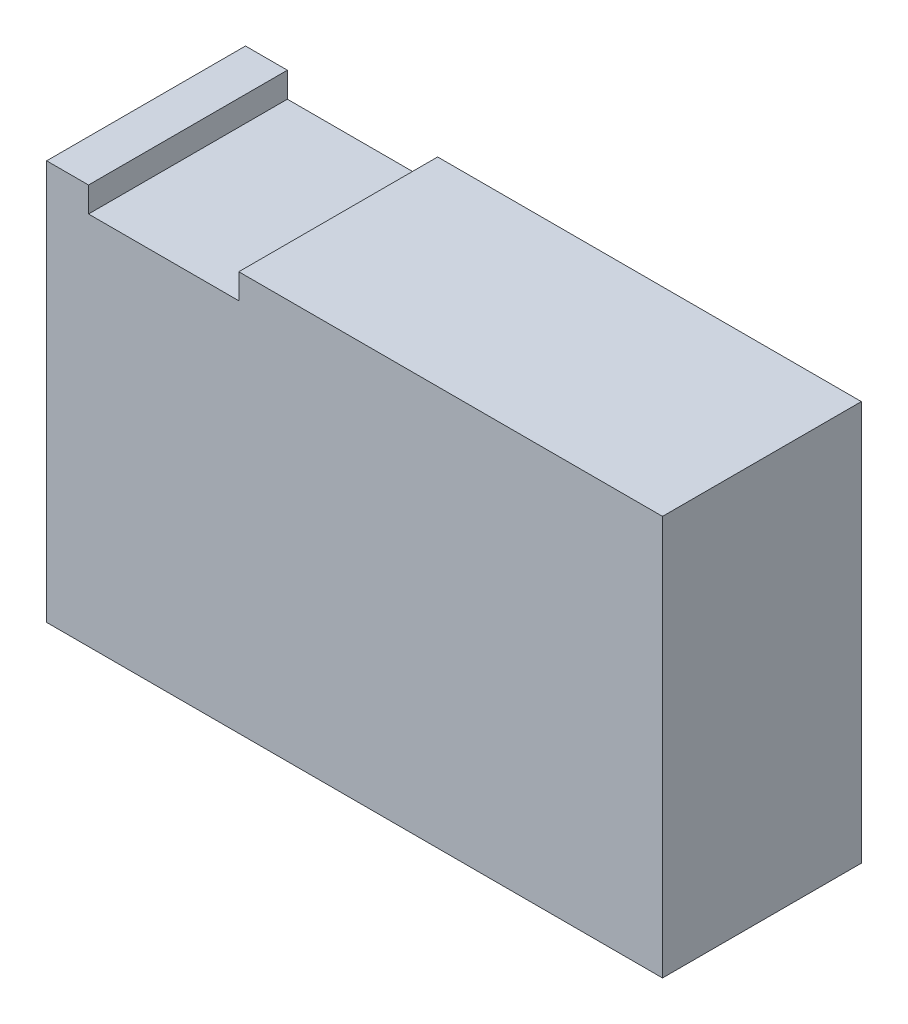
ISO-10303-21;
HEADER;
FILE_DESCRIPTION(('STEP AP214'),'2;1');
FILE_NAME('part.step','',(''),(''),'','','');
FILE_SCHEMA(('AUTOMOTIVE_DESIGN { 1 0 10303 214 1 1 1 1 }'));
ENDSEC;
DATA;
#1=APPLICATION_CONTEXT('core data for automotive mechanical design processes');
#2=APPLICATION_PROTOCOL_DEFINITION('international standard','automotive_design',2000,#1);
#3=PRODUCT_CONTEXT('',#1,'mechanical');
#4=PRODUCT('Part','Part','',(#3));
#5=PRODUCT_RELATED_PRODUCT_CATEGORY('part','',(#4));
#6=PRODUCT_DEFINITION_FORMATION('','',#4);
#7=PRODUCT_DEFINITION_CONTEXT('part definition',#1,'design');
#8=PRODUCT_DEFINITION('design','',#6,#7);
#9=PRODUCT_DEFINITION_SHAPE('','',#8);
#10=(LENGTH_UNIT() NAMED_UNIT(*) SI_UNIT(.MILLI.,.METRE.));
#11=(NAMED_UNIT(*) PLANE_ANGLE_UNIT() SI_UNIT($,.RADIAN.));
#12=(NAMED_UNIT(*) SI_UNIT($,.STERADIAN.) SOLID_ANGLE_UNIT());
#13=UNCERTAINTY_MEASURE_WITH_UNIT(LENGTH_MEASURE(1.E-05),#10,'distance_accuracy_value','');
#14=(GEOMETRIC_REPRESENTATION_CONTEXT(3) GLOBAL_UNCERTAINTY_ASSIGNED_CONTEXT((#13)) GLOBAL_UNIT_ASSIGNED_CONTEXT((#10,
#11,#12)) REPRESENTATION_CONTEXT('',''));
#15=CARTESIAN_POINT('',(0.,0.,0.));
#16=DIRECTION('',(0.,0.,1.));
#17=DIRECTION('',(1.,0.,0.));
#18=AXIS2_PLACEMENT_3D('',#15,#16,#17);
#19=CARTESIAN_POINT('',(0.,40.57,0.));
#20=DIRECTION('',(0.,-1.,0.));
#21=DIRECTION('',(0.,0.,-1.));
#22=AXIS2_PLACEMENT_3D('',#19,#20,#21);
#23=PLANE('',#22);
#24=DIRECTION('',(1.,0.,0.));
#25=VECTOR('',#24,1.);
#26=CARTESIAN_POINT('',(-31.25,40.57,10.09));
#27=LINE('',#26,#25);
#28=CARTESIAN_POINT('',(-31.25,40.57,10.09));
#29=VERTEX_POINT('',#28);
#30=CARTESIAN_POINT('',(-27.,40.57,10.09));
#31=VERTEX_POINT('',#30);
#32=EDGE_CURVE('E174',#29,#31,#27,.T.);
#33=ORIENTED_EDGE('',*,*,#32,.T.);
#34=DIRECTION('',(0.,0.,1.));
#35=VECTOR('',#34,1.);
#36=CARTESIAN_POINT('',(-27.,40.57,-10.09));
#37=LINE('',#36,#35);
#38=CARTESIAN_POINT('',(-27.,40.57,-10.09));
#39=VERTEX_POINT('',#38);
#40=EDGE_CURVE('E126',#39,#31,#37,.T.);
#41=ORIENTED_EDGE('',*,*,#40,.F.);
#42=DIRECTION('',(-1.,0.,0.));
#43=VECTOR('',#42,1.);
#44=CARTESIAN_POINT('',(-31.25,40.57,-10.09));
#45=LINE('',#44,#43);
#46=CARTESIAN_POINT('',(-31.25,40.57,-10.09));
#47=VERTEX_POINT('',#46);
#48=EDGE_CURVE('E168',#39,#47,#45,.T.);
#49=ORIENTED_EDGE('',*,*,#48,.T.);
#50=DIRECTION('',(0.,0.,1.));
#51=VECTOR('',#50,1.);
#52=CARTESIAN_POINT('',(-31.25,40.57,10.09));
#53=LINE('',#52,#51);
#54=EDGE_CURVE('E171',#47,#29,#53,.T.);
#55=ORIENTED_EDGE('',*,*,#54,.T.);
#56=EDGE_LOOP('',(#33,#41,#49,#55));
#57=FACE_BOUND('',#56,.T.);
#58=ADVANCED_FACE('F45',(#57),#23,.F.);
#59=CARTESIAN_POINT('',(31.25,40.57,10.09));
#60=DIRECTION('',(-1.,0.,0.));
#61=DIRECTION('',(0.,0.,1.));
#62=AXIS2_PLACEMENT_3D('',#59,#60,#61);
#63=PLANE('',#62);
#64=DIRECTION('',(0.,0.,-1.));
#65=VECTOR('',#64,1.);
#66=CARTESIAN_POINT('',(31.25,0.,10.09));
#67=LINE('',#66,#65);
#68=CARTESIAN_POINT('',(31.25,0.,10.09));
#69=VERTEX_POINT('',#68);
#70=CARTESIAN_POINT('',(31.25,0.,-10.09));
#71=VERTEX_POINT('',#70);
#72=EDGE_CURVE('E159',#69,#71,#67,.T.);
#73=ORIENTED_EDGE('',*,*,#72,.T.);
#74=DIRECTION('',(0.,-1.,0.));
#75=VECTOR('',#74,1.);
#76=CARTESIAN_POINT('',(31.25,40.57,-10.09));
#77=LINE('',#76,#75);
#78=CARTESIAN_POINT('',(31.25,40.57,-10.09));
#79=VERTEX_POINT('',#78);
#80=EDGE_CURVE('E11',#79,#71,#77,.T.);
#81=ORIENTED_EDGE('',*,*,#80,.F.);
#82=DIRECTION('',(0.,0.,-1.));
#83=VECTOR('',#82,1.);
#84=CARTESIAN_POINT('',(31.25,40.57,10.09));
#85=LINE('',#84,#83);
#86=CARTESIAN_POINT('',(31.25,40.57,10.09));
#87=VERTEX_POINT('',#86);
#88=EDGE_CURVE('E165',#87,#79,#85,.T.);
#89=ORIENTED_EDGE('',*,*,#88,.F.);
#90=DIRECTION('',(0.,-1.,0.));
#91=VECTOR('',#90,1.);
#92=CARTESIAN_POINT('',(31.25,40.57,10.09));
#93=LINE('',#92,#91);
#94=EDGE_CURVE('E177',#87,#69,#93,.T.);
#95=ORIENTED_EDGE('',*,*,#94,.T.);
#96=EDGE_LOOP('',(#73,#81,#89,#95));
#97=FACE_BOUND('',#96,.T.);
#98=ADVANCED_FACE('F47',(#97),#63,.F.);
#99=CARTESIAN_POINT('',(-31.25,40.57,-10.09));
#100=DIRECTION('',(0.,0.,1.));
#101=DIRECTION('',(1.,0.,0.));
#102=AXIS2_PLACEMENT_3D('',#99,#100,#101);
#103=PLANE('',#102);
#104=ORIENTED_EDGE('',*,*,#48,.F.);
#105=DIRECTION('',(0.,1.,0.));
#106=VECTOR('',#105,1.);
#107=CARTESIAN_POINT('',(-27.,38.02,-10.09));
#108=LINE('',#107,#106);
#109=CARTESIAN_POINT('',(-27.,38.02,-10.09));
#110=VERTEX_POINT('',#109);
#111=EDGE_CURVE('E156',#110,#39,#108,.T.);
#112=ORIENTED_EDGE('',*,*,#111,.F.);
#113=DIRECTION('',(-1.,0.,0.));
#114=VECTOR('',#113,1.);
#115=CARTESIAN_POINT('',(-27.,38.02,-10.09));
#116=LINE('',#115,#114);
#117=CARTESIAN_POINT('',(-11.75,38.02,-10.09));
#118=VERTEX_POINT('',#117);
#119=EDGE_CURVE('E131',#118,#110,#116,.T.);
#120=ORIENTED_EDGE('',*,*,#119,.F.);
#121=DIRECTION('',(0.,1.,0.));
#122=VECTOR('',#121,1.);
#123=CARTESIAN_POINT('',(-11.75,38.02,-10.09));
#124=LINE('',#123,#122);
#125=CARTESIAN_POINT('',(-11.75,40.57,-10.09));
#126=VERTEX_POINT('',#125);
#127=EDGE_CURVE('E160',#118,#126,#124,.T.);
#128=ORIENTED_EDGE('',*,*,#127,.T.);
#129=EDGE_CURVE('E98',#79,#126,#45,.T.);
#130=ORIENTED_EDGE('',*,*,#129,.F.);
#131=ORIENTED_EDGE('',*,*,#80,.T.);
#132=DIRECTION('',(-1.,0.,0.));
#133=VECTOR('',#132,1.);
#134=CARTESIAN_POINT('',(-31.25,0.,-10.09));
#135=LINE('',#134,#133);
#136=CARTESIAN_POINT('',(-31.25,0.,-10.09));
#137=VERTEX_POINT('',#136);
#138=EDGE_CURVE('E181',#71,#137,#135,.T.);
#139=ORIENTED_EDGE('',*,*,#138,.T.);
#140=DIRECTION('',(0.,-1.,0.));
#141=VECTOR('',#140,1.);
#142=CARTESIAN_POINT('',(-31.25,40.57,-10.09));
#143=LINE('',#142,#141);
#144=EDGE_CURVE('E54',#47,#137,#143,.T.);
#145=ORIENTED_EDGE('',*,*,#144,.F.);
#146=EDGE_LOOP('',(#104,#112,#120,#128,#130,#131,#139,#145));
#147=FACE_BOUND('',#146,.T.);
#148=ADVANCED_FACE('F211',(#147),#103,.F.);
#149=CARTESIAN_POINT('',(-31.25,40.57,10.09));
#150=DIRECTION('',(1.,0.,0.));
#151=DIRECTION('',(0.,0.,-1.));
#152=AXIS2_PLACEMENT_3D('',#149,#150,#151);
#153=PLANE('',#152);
#154=DIRECTION('',(0.,0.,1.));
#155=VECTOR('',#154,1.);
#156=CARTESIAN_POINT('',(-31.25,0.,10.09));
#157=LINE('',#156,#155);
#158=CARTESIAN_POINT('',(-31.25,0.,10.09));
#159=VERTEX_POINT('',#158);
#160=EDGE_CURVE('E184',#137,#159,#157,.T.);
#161=ORIENTED_EDGE('',*,*,#160,.T.);
#162=DIRECTION('',(0.,-1.,0.));
#163=VECTOR('',#162,1.);
#164=CARTESIAN_POINT('',(-31.25,40.57,10.09));
#165=LINE('',#164,#163);
#166=EDGE_CURVE('E191',#29,#159,#165,.T.);
#167=ORIENTED_EDGE('',*,*,#166,.F.);
#168=ORIENTED_EDGE('',*,*,#54,.F.);
#169=ORIENTED_EDGE('',*,*,#144,.T.);
#170=EDGE_LOOP('',(#161,#167,#168,#169));
#171=FACE_BOUND('',#170,.T.);
#172=ADVANCED_FACE('F199',(#171),#153,.F.);
#173=CARTESIAN_POINT('',(-31.25,40.57,10.09));
#174=DIRECTION('',(0.,0.,-1.));
#175=DIRECTION('',(-1.,0.,0.));
#176=AXIS2_PLACEMENT_3D('',#173,#174,#175);
#177=PLANE('',#176);
#178=DIRECTION('',(1.,0.,0.));
#179=VECTOR('',#178,1.);
#180=CARTESIAN_POINT('',(-27.,38.02,10.09));
#181=LINE('',#180,#179);
#182=CARTESIAN_POINT('',(-27.,38.02,10.09));
#183=VERTEX_POINT('',#182);
#184=CARTESIAN_POINT('',(-11.75,38.02,10.09));
#185=VERTEX_POINT('',#184);
#186=EDGE_CURVE('E137',#183,#185,#181,.T.);
#187=ORIENTED_EDGE('',*,*,#186,.F.);
#188=DIRECTION('',(0.,1.,0.));
#189=VECTOR('',#188,1.);
#190=CARTESIAN_POINT('',(-27.,38.02,10.09));
#191=LINE('',#190,#189);
#192=EDGE_CURVE('E120',#183,#31,#191,.T.);
#193=ORIENTED_EDGE('',*,*,#192,.T.);
#194=ORIENTED_EDGE('',*,*,#32,.F.);
#195=ORIENTED_EDGE('',*,*,#166,.T.);
#196=DIRECTION('',(1.,0.,0.));
#197=VECTOR('',#196,1.);
#198=CARTESIAN_POINT('',(-31.25,0.,10.09));
#199=LINE('',#198,#197);
#200=EDGE_CURVE('E91',#159,#69,#199,.T.);
#201=ORIENTED_EDGE('',*,*,#200,.T.);
#202=ORIENTED_EDGE('',*,*,#94,.F.);
#203=CARTESIAN_POINT('',(-11.75,40.57,10.09));
#204=VERTEX_POINT('',#203);
#205=EDGE_CURVE('E69',#204,#87,#27,.T.);
#206=ORIENTED_EDGE('',*,*,#205,.F.);
#207=DIRECTION('',(0.,1.,0.));
#208=VECTOR('',#207,1.);
#209=CARTESIAN_POINT('',(-11.75,38.02,10.09));
#210=LINE('',#209,#208);
#211=EDGE_CURVE('E61',#185,#204,#210,.T.);
#212=ORIENTED_EDGE('',*,*,#211,.F.);
#213=EDGE_LOOP('',(#187,#193,#194,#195,#201,#202,#206,#212));
#214=FACE_BOUND('',#213,.T.);
#215=ADVANCED_FACE('F143',(#214),#177,.F.);
#216=ORIENTED_EDGE('',*,*,#129,.T.);
#217=DIRECTION('',(0.,0.,-1.));
#218=VECTOR('',#217,1.);
#219=CARTESIAN_POINT('',(-11.75,40.57,-10.09));
#220=LINE('',#219,#218);
#221=EDGE_CURVE('E141',#204,#126,#220,.T.);
#222=ORIENTED_EDGE('',*,*,#221,.F.);
#223=ORIENTED_EDGE('',*,*,#205,.T.);
#224=ORIENTED_EDGE('',*,*,#88,.T.);
#225=EDGE_LOOP('',(#216,#222,#223,#224));
#226=FACE_BOUND('',#225,.T.);
#227=ADVANCED_FACE('F212',(#226),#23,.F.);
#228=CARTESIAN_POINT('',(0.,0.,0.));
#229=DIRECTION('',(0.,-1.,0.));
#230=DIRECTION('',(0.,0.,-1.));
#231=AXIS2_PLACEMENT_3D('',#228,#229,#230);
#232=PLANE('',#231);
#233=ORIENTED_EDGE('',*,*,#72,.F.);
#234=ORIENTED_EDGE('',*,*,#200,.F.);
#235=ORIENTED_EDGE('',*,*,#160,.F.);
#236=ORIENTED_EDGE('',*,*,#138,.F.);
#237=EDGE_LOOP('',(#233,#234,#235,#236));
#238=FACE_BOUND('',#237,.T.);
#239=ADVANCED_FACE('F204',(#238),#232,.T.);
#240=CARTESIAN_POINT('',(-27.,38.02,-10.09));
#241=DIRECTION('',(-1.,0.,0.));
#242=DIRECTION('',(0.,0.,1.));
#243=AXIS2_PLACEMENT_3D('',#240,#241,#242);
#244=PLANE('',#243);
#245=ORIENTED_EDGE('',*,*,#40,.T.);
#246=ORIENTED_EDGE('',*,*,#192,.F.);
#247=DIRECTION('',(0.,0.,1.));
#248=VECTOR('',#247,1.);
#249=CARTESIAN_POINT('',(-27.,38.02,-10.09));
#250=LINE('',#249,#248);
#251=EDGE_CURVE('E123',#110,#183,#250,.T.);
#252=ORIENTED_EDGE('',*,*,#251,.F.);
#253=ORIENTED_EDGE('',*,*,#111,.T.);
#254=EDGE_LOOP('',(#245,#246,#252,#253));
#255=FACE_BOUND('',#254,.T.);
#256=ADVANCED_FACE('F122',(#255),#244,.F.);
#257=CARTESIAN_POINT('',(-11.75,38.02,-10.09));
#258=DIRECTION('',(1.,0.,0.));
#259=DIRECTION('',(0.,0.,-1.));
#260=AXIS2_PLACEMENT_3D('',#257,#258,#259);
#261=PLANE('',#260);
#262=ORIENTED_EDGE('',*,*,#221,.T.);
#263=ORIENTED_EDGE('',*,*,#127,.F.);
#264=DIRECTION('',(0.,0.,-1.));
#265=VECTOR('',#264,1.);
#266=CARTESIAN_POINT('',(-11.75,38.02,-10.09));
#267=LINE('',#266,#265);
#268=EDGE_CURVE('E145',#185,#118,#267,.T.);
#269=ORIENTED_EDGE('',*,*,#268,.F.);
#270=ORIENTED_EDGE('',*,*,#211,.T.);
#271=EDGE_LOOP('',(#262,#263,#269,#270));
#272=FACE_BOUND('',#271,.T.);
#273=ADVANCED_FACE('F213',(#272),#261,.F.);
#274=CARTESIAN_POINT('',(0.,38.02,0.));
#275=DIRECTION('',(0.,1.,0.));
#276=DIRECTION('',(0.,0.,1.));
#277=AXIS2_PLACEMENT_3D('',#274,#275,#276);
#278=PLANE('',#277);
#279=ORIENTED_EDGE('',*,*,#251,.T.);
#280=ORIENTED_EDGE('',*,*,#186,.T.);
#281=ORIENTED_EDGE('',*,*,#268,.T.);
#282=ORIENTED_EDGE('',*,*,#119,.T.);
#283=EDGE_LOOP('',(#279,#280,#281,#282));
#284=FACE_BOUND('',#283,.T.);
#285=ADVANCED_FACE('F135',(#284),#278,.T.);
#286=CLOSED_SHELL('',(#58,#98,#148,#172,#215,#227,#239,#256,#273,#285));
#287=MANIFOLD_SOLID_BREP('B2',#286);
#288=ADVANCED_BREP_SHAPE_REPRESENTATION('',(#18,#287),#14);
#289=SHAPE_DEFINITION_REPRESENTATION(#9,#288);
ENDSEC;
END-ISO-10303-21;
